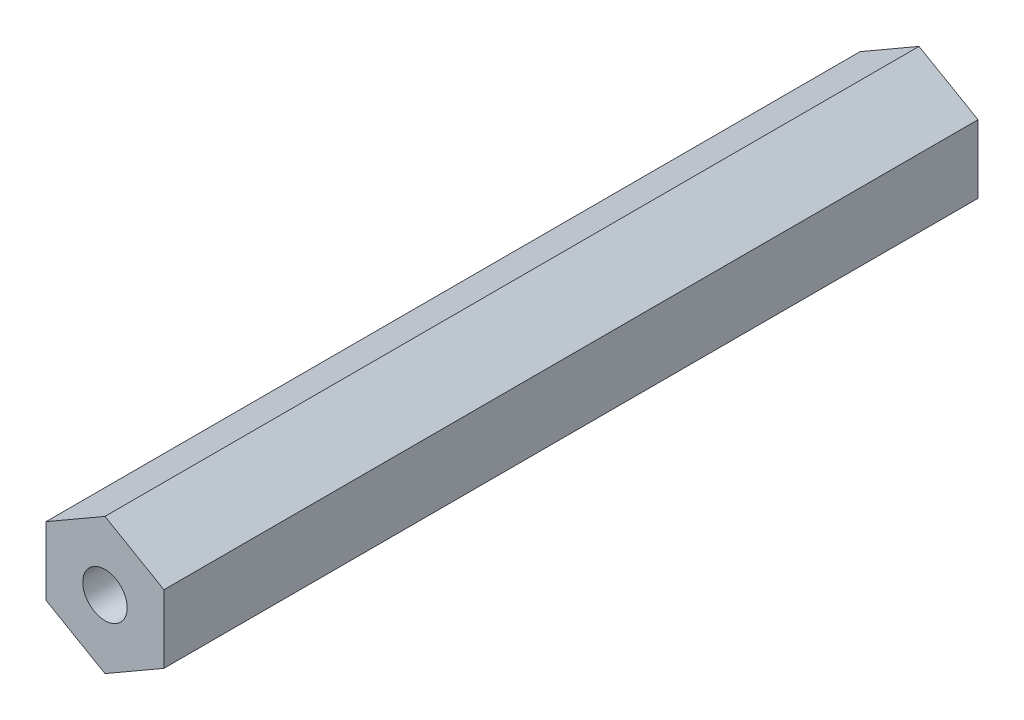
ISO-10303-21;
HEADER;
FILE_DESCRIPTION(('STEP AP214'),'2;1');
FILE_NAME('part.step','',(''),(''),'','','');
FILE_SCHEMA(('AUTOMOTIVE_DESIGN { 1 0 10303 214 1 1 1 1 }'));
ENDSEC;
DATA;
#1=APPLICATION_CONTEXT('core data for automotive mechanical design processes');
#2=APPLICATION_PROTOCOL_DEFINITION('international standard','automotive_design',2000,#1);
#3=PRODUCT_CONTEXT('',#1,'mechanical');
#4=PRODUCT('Part','Part','',(#3));
#5=PRODUCT_RELATED_PRODUCT_CATEGORY('part','',(#4));
#6=PRODUCT_DEFINITION_FORMATION('','',#4);
#7=PRODUCT_DEFINITION_CONTEXT('part definition',#1,'design');
#8=PRODUCT_DEFINITION('design','',#6,#7);
#9=PRODUCT_DEFINITION_SHAPE('','',#8);
#10=(LENGTH_UNIT() NAMED_UNIT(*) SI_UNIT(.MILLI.,.METRE.));
#11=(NAMED_UNIT(*) PLANE_ANGLE_UNIT() SI_UNIT($,.RADIAN.));
#12=(NAMED_UNIT(*) SI_UNIT($,.STERADIAN.) SOLID_ANGLE_UNIT());
#13=UNCERTAINTY_MEASURE_WITH_UNIT(LENGTH_MEASURE(1.E-05),#10,'distance_accuracy_value','');
#14=(GEOMETRIC_REPRESENTATION_CONTEXT(3) GLOBAL_UNCERTAINTY_ASSIGNED_CONTEXT((#13)) GLOBAL_UNIT_ASSIGNED_CONTEXT((#10,
#11,#12)) REPRESENTATION_CONTEXT('',''));
#15=CARTESIAN_POINT('',(0.,0.,0.));
#16=DIRECTION('',(0.,0.,1.));
#17=DIRECTION('',(1.,0.,0.));
#18=AXIS2_PLACEMENT_3D('',#15,#16,#17);
#19=CARTESIAN_POINT('',(0.,0.,55.));
#20=DIRECTION('',(0.,0.,1.));
#21=DIRECTION('',(1.,0.,0.));
#22=AXIS2_PLACEMENT_3D('',#19,#20,#21);
#23=PLANE('',#22);
#24=DIRECTION('',(0.866025403784439,0.5,0.));
#25=VECTOR('',#24,1.);
#26=CARTESIAN_POINT('',(0.,-4.6,55.));
#27=LINE('',#26,#25);
#28=CARTESIAN_POINT('',(0.,-4.6,55.));
#29=VERTEX_POINT('',#28);
#30=CARTESIAN_POINT('',(3.98371685740842,-2.3,55.));
#31=VERTEX_POINT('',#30);
#32=EDGE_CURVE('E132',#29,#31,#27,.T.);
#33=ORIENTED_EDGE('',*,*,#32,.T.);
#34=DIRECTION('',(0.,1.,0.));
#35=VECTOR('',#34,1.);
#36=CARTESIAN_POINT('',(3.98371685740842,-2.3,55.));
#37=LINE('',#36,#35);
#38=CARTESIAN_POINT('',(3.98371685740842,2.3,55.));
#39=VERTEX_POINT('',#38);
#40=EDGE_CURVE('E90',#31,#39,#37,.T.);
#41=ORIENTED_EDGE('',*,*,#40,.T.);
#42=DIRECTION('',(-0.866025403784439,0.5,0.));
#43=VECTOR('',#42,1.);
#44=CARTESIAN_POINT('',(3.98371685740842,2.3,55.));
#45=LINE('',#44,#43);
#46=CARTESIAN_POINT('',(0.,4.6,55.));
#47=VERTEX_POINT('',#46);
#48=EDGE_CURVE('E103',#39,#47,#45,.T.);
#49=ORIENTED_EDGE('',*,*,#48,.T.);
#50=DIRECTION('',(-0.866025403784438,-0.5,0.));
#51=VECTOR('',#50,1.);
#52=CARTESIAN_POINT('',(0.,4.6,55.));
#53=LINE('',#52,#51);
#54=CARTESIAN_POINT('',(-3.98371685740842,2.3,55.));
#55=VERTEX_POINT('',#54);
#56=EDGE_CURVE('E97',#47,#55,#53,.T.);
#57=ORIENTED_EDGE('',*,*,#56,.T.);
#58=DIRECTION('',(0.,-1.,0.));
#59=VECTOR('',#58,1.);
#60=CARTESIAN_POINT('',(-3.98371685740842,2.3,55.));
#61=LINE('',#60,#59);
#62=CARTESIAN_POINT('',(-3.98371685740842,-2.3,55.));
#63=VERTEX_POINT('',#62);
#64=EDGE_CURVE('E101',#55,#63,#61,.T.);
#65=ORIENTED_EDGE('',*,*,#64,.T.);
#66=DIRECTION('',(0.866025403784439,-0.5,0.));
#67=VECTOR('',#66,1.);
#68=CARTESIAN_POINT('',(-3.98371685740842,-2.3,55.));
#69=LINE('',#68,#67);
#70=EDGE_CURVE('E53',#63,#29,#69,.T.);
#71=ORIENTED_EDGE('',*,*,#70,.T.);
#72=EDGE_LOOP('',(#33,#41,#49,#57,#65,#71));
#73=FACE_BOUND('',#72,.T.);
#74=CARTESIAN_POINT('',(0.,0.,55.));
#75=DIRECTION('',(0.,0.,1.));
#76=DIRECTION('',(1.,0.,0.));
#77=AXIS2_PLACEMENT_3D('',#74,#75,#76);
#78=CIRCLE('',#77,1.5);
#79=CARTESIAN_POINT('',(1.5,0.,55.));
#80=VERTEX_POINT('',#79);
#81=EDGE_CURVE('E125',#80,#80,#78,.T.);
#82=ORIENTED_EDGE('',*,*,#81,.F.);
#83=EDGE_LOOP('',(#82));
#84=FACE_BOUND('',#83,.T.);
#85=ADVANCED_FACE('F36',(#73,#84),#23,.T.);
#86=CARTESIAN_POINT('',(0.,0.,0.));
#87=DIRECTION('',(0.,0.,1.));
#88=DIRECTION('',(1.,0.,0.));
#89=AXIS2_PLACEMENT_3D('',#86,#87,#88);
#90=PLANE('',#89);
#91=DIRECTION('',(0.866025403784439,0.5,0.));
#92=VECTOR('',#91,1.);
#93=CARTESIAN_POINT('',(0.,-4.6,0.));
#94=LINE('',#93,#92);
#95=CARTESIAN_POINT('',(0.,-4.6,0.));
#96=VERTEX_POINT('',#95);
#97=CARTESIAN_POINT('',(3.98371685740842,-2.3,0.));
#98=VERTEX_POINT('',#97);
#99=EDGE_CURVE('E121',#96,#98,#94,.T.);
#100=ORIENTED_EDGE('',*,*,#99,.F.);
#101=DIRECTION('',(0.866025403784439,-0.5,0.));
#102=VECTOR('',#101,1.);
#103=CARTESIAN_POINT('',(-3.98371685740842,-2.3,0.));
#104=LINE('',#103,#102);
#105=CARTESIAN_POINT('',(-3.98371685740842,-2.3,0.));
#106=VERTEX_POINT('',#105);
#107=EDGE_CURVE('E82',#106,#96,#104,.T.);
#108=ORIENTED_EDGE('',*,*,#107,.F.);
#109=DIRECTION('',(0.,-1.,0.));
#110=VECTOR('',#109,1.);
#111=CARTESIAN_POINT('',(-3.98371685740842,2.3,0.));
#112=LINE('',#111,#110);
#113=CARTESIAN_POINT('',(-3.98371685740842,2.3,0.));
#114=VERTEX_POINT('',#113);
#115=EDGE_CURVE('E76',#114,#106,#112,.T.);
#116=ORIENTED_EDGE('',*,*,#115,.F.);
#117=DIRECTION('',(-0.866025403784438,-0.5,0.));
#118=VECTOR('',#117,1.);
#119=CARTESIAN_POINT('',(0.,4.6,0.));
#120=LINE('',#119,#118);
#121=CARTESIAN_POINT('',(0.,4.6,0.));
#122=VERTEX_POINT('',#121);
#123=EDGE_CURVE('E111',#122,#114,#120,.T.);
#124=ORIENTED_EDGE('',*,*,#123,.F.);
#125=DIRECTION('',(-0.866025403784439,0.5,0.));
#126=VECTOR('',#125,1.);
#127=CARTESIAN_POINT('',(3.98371685740842,2.3,0.));
#128=LINE('',#127,#126);
#129=CARTESIAN_POINT('',(3.98371685740842,2.3,0.));
#130=VERTEX_POINT('',#129);
#131=EDGE_CURVE('E127',#130,#122,#128,.T.);
#132=ORIENTED_EDGE('',*,*,#131,.F.);
#133=DIRECTION('',(0.,1.,0.));
#134=VECTOR('',#133,1.);
#135=CARTESIAN_POINT('',(3.98371685740842,-2.3,0.));
#136=LINE('',#135,#134);
#137=EDGE_CURVE('E124',#98,#130,#136,.T.);
#138=ORIENTED_EDGE('',*,*,#137,.F.);
#139=EDGE_LOOP('',(#100,#108,#116,#124,#132,#138));
#140=FACE_BOUND('',#139,.T.);
#141=CARTESIAN_POINT('',(0.,0.,0.));
#142=DIRECTION('',(0.,0.,1.));
#143=DIRECTION('',(1.,0.,0.));
#144=AXIS2_PLACEMENT_3D('',#141,#142,#143);
#145=CIRCLE('',#144,1.5);
#146=CARTESIAN_POINT('',(1.5,0.,0.));
#147=VERTEX_POINT('',#146);
#148=EDGE_CURVE('E225',#147,#147,#145,.T.);
#149=ORIENTED_EDGE('',*,*,#148,.T.);
#150=EDGE_LOOP('',(#149));
#151=FACE_BOUND('',#150,.T.);
#152=ADVANCED_FACE('F141',(#140,#151),#90,.F.);
#153=CARTESIAN_POINT('',(0.,-4.6,55.));
#154=DIRECTION('',(-0.5,0.866025403784439,0.));
#155=DIRECTION('',(-0.866025403784439,-0.5,0.));
#156=AXIS2_PLACEMENT_3D('',#153,#154,#155);
#157=PLANE('',#156);
#158=ORIENTED_EDGE('',*,*,#99,.T.);
#159=DIRECTION('',(0.,0.,-1.));
#160=VECTOR('',#159,1.);
#161=CARTESIAN_POINT('',(3.98371685740842,-2.3,55.));
#162=LINE('',#161,#160);
#163=EDGE_CURVE('E11',#31,#98,#162,.T.);
#164=ORIENTED_EDGE('',*,*,#163,.F.);
#165=ORIENTED_EDGE('',*,*,#32,.F.);
#166=DIRECTION('',(0.,0.,-1.));
#167=VECTOR('',#166,1.);
#168=CARTESIAN_POINT('',(0.,-4.6,55.));
#169=LINE('',#168,#167);
#170=EDGE_CURVE('E117',#29,#96,#169,.T.);
#171=ORIENTED_EDGE('',*,*,#170,.T.);
#172=EDGE_LOOP('',(#158,#164,#165,#171));
#173=FACE_BOUND('',#172,.T.);
#174=ADVANCED_FACE('F38',(#173),#157,.F.);
#175=CARTESIAN_POINT('',(3.98371685740842,-2.3,55.));
#176=DIRECTION('',(-1.,0.,0.));
#177=DIRECTION('',(0.,-1.,0.));
#178=AXIS2_PLACEMENT_3D('',#175,#176,#177);
#179=PLANE('',#178);
#180=ORIENTED_EDGE('',*,*,#137,.T.);
#181=DIRECTION('',(0.,0.,-1.));
#182=VECTOR('',#181,1.);
#183=CARTESIAN_POINT('',(3.98371685740842,2.3,55.));
#184=LINE('',#183,#182);
#185=EDGE_CURVE('E45',#39,#130,#184,.T.);
#186=ORIENTED_EDGE('',*,*,#185,.F.);
#187=ORIENTED_EDGE('',*,*,#40,.F.);
#188=ORIENTED_EDGE('',*,*,#163,.T.);
#189=EDGE_LOOP('',(#180,#186,#187,#188));
#190=FACE_BOUND('',#189,.T.);
#191=ADVANCED_FACE('F166',(#190),#179,.F.);
#192=CARTESIAN_POINT('',(3.98371685740842,2.3,55.));
#193=DIRECTION('',(-0.5,-0.866025403784439,0.));
#194=DIRECTION('',(0.866025403784439,-0.5,0.));
#195=AXIS2_PLACEMENT_3D('',#192,#193,#194);
#196=PLANE('',#195);
#197=ORIENTED_EDGE('',*,*,#131,.T.);
#198=DIRECTION('',(0.,0.,-1.));
#199=VECTOR('',#198,1.);
#200=CARTESIAN_POINT('',(0.,4.6,55.));
#201=LINE('',#200,#199);
#202=EDGE_CURVE('E112',#47,#122,#201,.T.);
#203=ORIENTED_EDGE('',*,*,#202,.F.);
#204=ORIENTED_EDGE('',*,*,#48,.F.);
#205=ORIENTED_EDGE('',*,*,#185,.T.);
#206=EDGE_LOOP('',(#197,#203,#204,#205));
#207=FACE_BOUND('',#206,.T.);
#208=ADVANCED_FACE('F138',(#207),#196,.F.);
#209=CARTESIAN_POINT('',(0.,4.6,55.));
#210=DIRECTION('',(0.5,-0.866025403784438,0.));
#211=DIRECTION('',(0.866025403784438,0.5,0.));
#212=AXIS2_PLACEMENT_3D('',#209,#210,#211);
#213=PLANE('',#212);
#214=ORIENTED_EDGE('',*,*,#123,.T.);
#215=DIRECTION('',(0.,0.,-1.));
#216=VECTOR('',#215,1.);
#217=CARTESIAN_POINT('',(-3.98371685740842,2.3,55.));
#218=LINE('',#217,#216);
#219=EDGE_CURVE('E108',#55,#114,#218,.T.);
#220=ORIENTED_EDGE('',*,*,#219,.F.);
#221=ORIENTED_EDGE('',*,*,#56,.F.);
#222=ORIENTED_EDGE('',*,*,#202,.T.);
#223=EDGE_LOOP('',(#214,#220,#221,#222));
#224=FACE_BOUND('',#223,.T.);
#225=ADVANCED_FACE('F109',(#224),#213,.F.);
#226=CARTESIAN_POINT('',(-3.98371685740842,2.3,55.));
#227=DIRECTION('',(1.,0.,0.));
#228=DIRECTION('',(0.,1.,0.));
#229=AXIS2_PLACEMENT_3D('',#226,#227,#228);
#230=PLANE('',#229);
#231=ORIENTED_EDGE('',*,*,#115,.T.);
#232=DIRECTION('',(0.,0.,-1.));
#233=VECTOR('',#232,1.);
#234=CARTESIAN_POINT('',(-3.98371685740842,-2.3,55.));
#235=LINE('',#234,#233);
#236=EDGE_CURVE('E113',#63,#106,#235,.T.);
#237=ORIENTED_EDGE('',*,*,#236,.F.);
#238=ORIENTED_EDGE('',*,*,#64,.F.);
#239=ORIENTED_EDGE('',*,*,#219,.T.);
#240=EDGE_LOOP('',(#231,#237,#238,#239));
#241=FACE_BOUND('',#240,.T.);
#242=ADVANCED_FACE('F115',(#241),#230,.F.);
#243=CARTESIAN_POINT('',(-3.98371685740842,-2.3,55.));
#244=DIRECTION('',(0.5,0.866025403784439,0.));
#245=DIRECTION('',(-0.866025403784438,0.5,0.));
#246=AXIS2_PLACEMENT_3D('',#243,#244,#245);
#247=PLANE('',#246);
#248=ORIENTED_EDGE('',*,*,#107,.T.);
#249=ORIENTED_EDGE('',*,*,#170,.F.);
#250=ORIENTED_EDGE('',*,*,#70,.F.);
#251=ORIENTED_EDGE('',*,*,#236,.T.);
#252=EDGE_LOOP('',(#248,#249,#250,#251));
#253=FACE_BOUND('',#252,.T.);
#254=ADVANCED_FACE('F146',(#253),#247,.F.);
#255=CARTESIAN_POINT('',(0.,0.,55.));
#256=DIRECTION('',(0.,0.,-1.));
#257=DIRECTION('',(-1.,0.,0.));
#258=AXIS2_PLACEMENT_3D('',#255,#256,#257);
#259=CYLINDRICAL_SURFACE('',#258,1.5);
#260=ORIENTED_EDGE('',*,*,#81,.T.);
#261=EDGE_LOOP('',(#260));
#262=FACE_BOUND('',#261,.T.);
#263=ORIENTED_EDGE('',*,*,#148,.F.);
#264=EDGE_LOOP('',(#263));
#265=FACE_BOUND('',#264,.T.);
#266=ADVANCED_FACE('F148',(#262,#265),#259,.F.);
#267=CLOSED_SHELL('',(#85,#152,#174,#191,#208,#225,#242,#254,#266));
#268=MANIFOLD_SOLID_BREP('B2',#267);
#269=ADVANCED_BREP_SHAPE_REPRESENTATION('',(#18,#268),#14);
#270=SHAPE_DEFINITION_REPRESENTATION(#9,#269);
ENDSEC;
END-ISO-10303-21;
